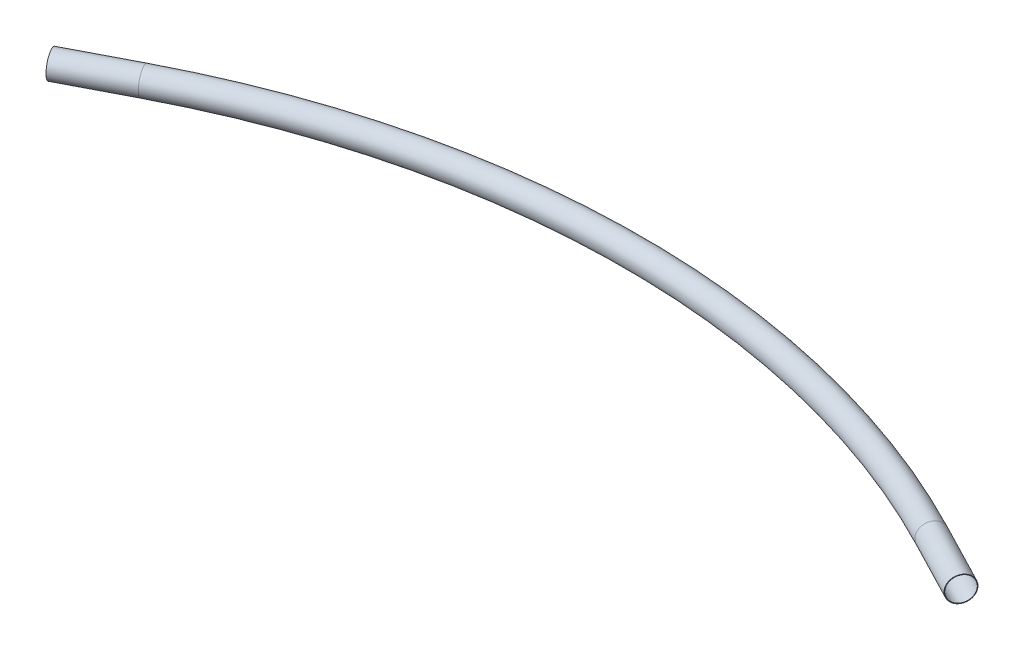
ISO-10303-21;
HEADER;
FILE_DESCRIPTION(('STEP AP214'),'2;1');
FILE_NAME('part.step','',(''),(''),'','','');
FILE_SCHEMA(('AUTOMOTIVE_DESIGN { 1 0 10303 214 1 1 1 1 }'));
ENDSEC;
DATA;
#1=APPLICATION_CONTEXT('core data for automotive mechanical design processes');
#2=APPLICATION_PROTOCOL_DEFINITION('international standard','automotive_design',2000,#1);
#3=PRODUCT_CONTEXT('',#1,'mechanical');
#4=PRODUCT('Part','Part','',(#3));
#5=PRODUCT_RELATED_PRODUCT_CATEGORY('part','',(#4));
#6=PRODUCT_DEFINITION_FORMATION('','',#4);
#7=PRODUCT_DEFINITION_CONTEXT('part definition',#1,'design');
#8=PRODUCT_DEFINITION('design','',#6,#7);
#9=PRODUCT_DEFINITION_SHAPE('','',#8);
#10=(LENGTH_UNIT() NAMED_UNIT(*) SI_UNIT(.MILLI.,.METRE.));
#11=(NAMED_UNIT(*) PLANE_ANGLE_UNIT() SI_UNIT($,.RADIAN.));
#12=(NAMED_UNIT(*) SI_UNIT($,.STERADIAN.) SOLID_ANGLE_UNIT());
#13=UNCERTAINTY_MEASURE_WITH_UNIT(LENGTH_MEASURE(1.E-05),#10,'distance_accuracy_value','');
#14=(GEOMETRIC_REPRESENTATION_CONTEXT(3) GLOBAL_UNCERTAINTY_ASSIGNED_CONTEXT((#13)) GLOBAL_UNIT_ASSIGNED_CONTEXT((#10,
#11,#12)) REPRESENTATION_CONTEXT('',''));
#15=CARTESIAN_POINT('',(0.,0.,0.));
#16=DIRECTION('',(0.,0.,1.));
#17=DIRECTION('',(1.,0.,0.));
#18=AXIS2_PLACEMENT_3D('',#15,#16,#17);
#19=CARTESIAN_POINT('',(-3036.38064650216,0.,210.434297638426));
#20=DIRECTION('',(0.887780285437791,0.,-0.460267492647475));
#21=DIRECTION('',(-0.460267492647475,0.,-0.887780285437792));
#22=AXIS2_PLACEMENT_3D('',#19,#20,#21);
#23=CYLINDRICAL_SURFACE('',#22,80.7339);
#24=CARTESIAN_POINT('',(-3036.38064650216,0.,210.434297638426));
#25=DIRECTION('',(-0.887780285437791,0.,0.460267492647476));
#26=DIRECTION('',(0.460267492647476,0.,0.887780285437791));
#27=AXIS2_PLACEMENT_3D('',#24,#25,#26);
#28=CIRCLE('',#27,80.7339);
#29=CARTESIAN_POINT('',(-2999.22145677751,0.,282.108262424932));
#30=VERTEX_POINT('',#29);
#31=EDGE_CURVE('E52',#30,#30,#28,.T.);
#32=ORIENTED_EDGE('',*,*,#31,.T.);
#33=EDGE_LOOP('',(#32));
#34=FACE_BOUND('',#33,.T.);
#35=CARTESIAN_POINT('',(-2630.4875,0.,0.));
#36=DIRECTION('',(-0.887780285437791,0.,0.460267492647476));
#37=DIRECTION('',(0.460267492647476,0.,0.887780285437791));
#38=AXIS2_PLACEMENT_3D('',#35,#36,#37);
#39=CIRCLE('',#38,80.7339);
#40=CARTESIAN_POINT('',(-2593.32831027535,0.,71.6739647865061));
#41=VERTEX_POINT('',#40);
#42=EDGE_CURVE('E58',#41,#41,#39,.T.);
#43=ORIENTED_EDGE('',*,*,#42,.F.);
#44=EDGE_LOOP('',(#43));
#45=FACE_BOUND('',#44,.T.);
#46=ADVANCED_FACE('F45',(#34,#45),#23,.F.);
#47=CARTESIAN_POINT('',(-3036.38064650216,0.,210.434297638426));
#48=DIRECTION('',(0.887780285437791,0.,-0.460267492647475));
#49=DIRECTION('',(-0.460267492647475,0.,-0.887780285437792));
#50=AXIS2_PLACEMENT_3D('',#47,#48,#49);
#51=CYLINDRICAL_SURFACE('',#50,84.1375000000001);
#52=CARTESIAN_POINT('',(-3036.38064650216,0.,210.434297638426));
#53=DIRECTION('',(-0.887780285437791,0.,0.460267492647476));
#54=DIRECTION('',(0.460267492647476,0.,0.887780285437791));
#55=AXIS2_PLACEMENT_3D('',#52,#53,#54);
#56=CIRCLE('',#55,84.1375000000001);
#57=CARTESIAN_POINT('',(-2997.65489033953,0.,285.129911404448));
#58=VERTEX_POINT('',#57);
#59=EDGE_CURVE('E12',#58,#58,#56,.T.);
#60=ORIENTED_EDGE('',*,*,#59,.F.);
#61=EDGE_LOOP('',(#60));
#62=FACE_BOUND('',#61,.T.);
#63=CARTESIAN_POINT('',(-2630.4875,0.,0.));
#64=DIRECTION('',(-0.887780285437791,0.,0.460267492647476));
#65=DIRECTION('',(0.460267492647476,0.,0.887780285437791));
#66=AXIS2_PLACEMENT_3D('',#63,#64,#65);
#67=CIRCLE('',#66,84.1375000000001);
#68=CARTESIAN_POINT('',(-2591.76174383737,0.,74.6956137660222));
#69=VERTEX_POINT('',#68);
#70=EDGE_CURVE('E48',#69,#69,#67,.T.);
#71=ORIENTED_EDGE('',*,*,#70,.T.);
#72=EDGE_LOOP('',(#71));
#73=FACE_BOUND('',#72,.T.);
#74=ADVANCED_FACE('F65',(#62,#73),#51,.T.);
#75=CARTESIAN_POINT('',(-3036.38064650216,0.,210.434297638426));
#76=DIRECTION('',(-0.887780285437791,0.,0.460267492647476));
#77=DIRECTION('',(0.460267492647476,0.,0.887780285437791));
#78=AXIS2_PLACEMENT_3D('',#75,#76,#77);
#79=PLANE('',#78);
#80=ORIENTED_EDGE('',*,*,#31,.F.);
#81=EDGE_LOOP('',(#80));
#82=FACE_BOUND('',#81,.T.);
#83=ORIENTED_EDGE('',*,*,#59,.T.);
#84=EDGE_LOOP('',(#83));
#85=FACE_BOUND('',#84,.T.);
#86=ADVANCED_FACE('F69',(#82,#85),#79,.T.);
#87=CARTESIAN_POINT('',(-2630.4875,0.,0.));
#88=DIRECTION('',(-0.887780285437791,0.,0.460267492647476));
#89=DIRECTION('',(0.460267492647476,0.,0.887780285437791));
#90=AXIS2_PLACEMENT_3D('',#87,#88,#89);
#91=PLANE('',#90);
#92=ORIENTED_EDGE('',*,*,#42,.T.);
#93=EDGE_LOOP('',(#92));
#94=FACE_BOUND('',#93,.T.);
#95=ORIENTED_EDGE('',*,*,#70,.F.);
#96=EDGE_LOOP('',(#95));
#97=FACE_BOUND('',#96,.T.);
#98=ADVANCED_FACE('F67',(#94,#97),#91,.F.);
#99=CLOSED_SHELL('',(#46,#74,#86,#98));
#100=MANIFOLD_SOLID_BREP('B2',#99);
#101=CARTESIAN_POINT('',(0.,0.,5073.77770730198));
#102=DIRECTION('',(0.,-1.,0.));
#103=DIRECTION('',(0.,0.,-1.));
#104=AXIS2_PLACEMENT_3D('',#101,#102,#103);
#105=TOROIDAL_SURFACE('',#104,5715.12770730198,80.7339);
#106=CARTESIAN_POINT('',(-2630.4875,0.,0.));
#107=DIRECTION('',(-0.887780285437791,0.,0.460267492647476));
#108=DIRECTION('',(0.460267492647476,0.,0.887780285437791));
#109=AXIS2_PLACEMENT_3D('',#106,#107,#108);
#110=CIRCLE('',#109,80.7339);
#111=CARTESIAN_POINT('',(-2667.64668972465,0.,-71.6739647865063));
#112=VERTEX_POINT('',#111);
#113=EDGE_CURVE('E129',#112,#112,#110,.T.);
#114=CARTESIAN_POINT('',(2630.4875,0.,-2.22044604925031E-13));
#115=DIRECTION('',(-0.887780285437791,0.,-0.460267492647476));
#116=DIRECTION('',(-0.460267492647476,0.,0.887780285437791));
#117=AXIS2_PLACEMENT_3D('',#114,#115,#116);
#118=CIRCLE('',#117,80.7339);
#119=CARTESIAN_POINT('',(2667.64668972465,0.,-71.6739647865063));
#120=VERTEX_POINT('',#119);
#121=EDGE_CURVE('E137',#120,#120,#118,.T.);
#122=CARTESIAN_POINT('',(0.,0.,5073.77770730198));
#123=DIRECTION('',(0.,-1.,0.));
#124=DIRECTION('',(0.,0.,-1.));
#125=AXIS2_PLACEMENT_3D('',#122,#123,#124);
#126=CIRCLE('',#125,5795.86160730198);
#127=EDGE_CURVE('',#112,#120,#126,.T.);
#128=ORIENTED_EDGE('',*,*,#113,.T.);
#129=ORIENTED_EDGE('',*,*,#121,.F.);
#130=ORIENTED_EDGE('',*,*,#127,.T.);
#131=ORIENTED_EDGE('',*,*,#127,.F.);
#132=EDGE_LOOP('',(#128,#130,#129,#131));
#133=FACE_BOUND('',#132,.T.);
#134=ADVANCED_FACE('F122',(#133),#105,.F.);
#135=CARTESIAN_POINT('',(0.,0.,5073.77770730198));
#136=DIRECTION('',(0.,-1.,0.));
#137=DIRECTION('',(0.,0.,-1.));
#138=AXIS2_PLACEMENT_3D('',#135,#136,#137);
#139=TOROIDAL_SURFACE('',#138,5715.12770730198,84.1375000000001);
#140=CARTESIAN_POINT('',(-2630.4875,0.,0.));
#141=DIRECTION('',(-0.887780285437791,0.,0.460267492647476));
#142=DIRECTION('',(0.460267492647476,0.,0.887780285437791));
#143=AXIS2_PLACEMENT_3D('',#140,#141,#142);
#144=CIRCLE('',#143,84.1375000000001);
#145=CARTESIAN_POINT('',(-2669.21325616263,0.,-74.6956137660222));
#146=VERTEX_POINT('',#145);
#147=EDGE_CURVE('E44',#146,#146,#144,.T.);
#148=CARTESIAN_POINT('',(2630.4875,0.,-2.22044604925031E-13));
#149=DIRECTION('',(-0.887780285437791,0.,-0.460267492647476));
#150=DIRECTION('',(-0.460267492647476,0.,0.887780285437791));
#151=AXIS2_PLACEMENT_3D('',#148,#149,#150);
#152=CIRCLE('',#151,84.1375000000001);
#153=CARTESIAN_POINT('',(2669.21325616263,0.,-74.6956137660222));
#154=VERTEX_POINT('',#153);
#155=EDGE_CURVE('E133',#154,#154,#152,.T.);
#156=CARTESIAN_POINT('',(0.,0.,5073.77770730198));
#157=DIRECTION('',(0.,-1.,0.));
#158=DIRECTION('',(0.,0.,-1.));
#159=AXIS2_PLACEMENT_3D('',#156,#157,#158);
#160=CIRCLE('',#159,5799.26520730198);
#161=EDGE_CURVE('',#146,#154,#160,.T.);
#162=ORIENTED_EDGE('',*,*,#147,.F.);
#163=ORIENTED_EDGE('',*,*,#155,.T.);
#164=ORIENTED_EDGE('',*,*,#161,.T.);
#165=ORIENTED_EDGE('',*,*,#161,.F.);
#166=EDGE_LOOP('',(#162,#164,#163,#165));
#167=FACE_BOUND('',#166,.T.);
#168=ADVANCED_FACE('F124',(#167),#139,.T.);
#169=CARTESIAN_POINT('',(-2630.4875,0.,0.));
#170=DIRECTION('',(-0.887780285437791,0.,0.460267492647476));
#171=DIRECTION('',(0.460267492647476,0.,0.887780285437791));
#172=AXIS2_PLACEMENT_3D('',#169,#170,#171);
#173=PLANE('',#172);
#174=ORIENTED_EDGE('',*,*,#113,.F.);
#175=EDGE_LOOP('',(#174));
#176=FACE_BOUND('',#175,.T.);
#177=ORIENTED_EDGE('',*,*,#147,.T.);
#178=EDGE_LOOP('',(#177));
#179=FACE_BOUND('',#178,.T.);
#180=ADVANCED_FACE('F147',(#176,#179),#173,.T.);
#181=CARTESIAN_POINT('',(2630.4875,0.,-2.22044604925031E-13));
#182=DIRECTION('',(-0.887780285437791,0.,-0.460267492647476));
#183=DIRECTION('',(-0.460267492647476,0.,0.887780285437791));
#184=AXIS2_PLACEMENT_3D('',#181,#182,#183);
#185=PLANE('',#184);
#186=ORIENTED_EDGE('',*,*,#121,.T.);
#187=EDGE_LOOP('',(#186));
#188=FACE_BOUND('',#187,.T.);
#189=ORIENTED_EDGE('',*,*,#155,.F.);
#190=EDGE_LOOP('',(#189));
#191=FACE_BOUND('',#190,.T.);
#192=ADVANCED_FACE('F143',(#188,#191),#185,.F.);
#193=CLOSED_SHELL('',(#134,#168,#180,#192));
#194=MANIFOLD_SOLID_BREP('B7',#193);
#195=CARTESIAN_POINT('',(2630.4875,0.,-2.22044604925031E-13));
#196=DIRECTION('',(0.887780285437791,0.,0.460267492647475));
#197=DIRECTION('',(0.460267492647475,0.,-0.887780285437792));
#198=AXIS2_PLACEMENT_3D('',#195,#196,#197);
#199=CYLINDRICAL_SURFACE('',#198,80.7339);
#200=CARTESIAN_POINT('',(2630.4875,0.,-2.22044604925031E-13));
#201=DIRECTION('',(-0.887780285437791,0.,-0.460267492647476));
#202=DIRECTION('',(-0.460267492647476,0.,0.887780285437791));
#203=AXIS2_PLACEMENT_3D('',#200,#201,#202);
#204=CIRCLE('',#203,80.7339);
#205=CARTESIAN_POINT('',(2667.64668972465,0.,-71.6739647865062));
#206=VERTEX_POINT('',#205);
#207=EDGE_CURVE('E199',#206,#206,#204,.T.);
#208=CARTESIAN_POINT('',(3036.38064650216,0.,210.434297638425));
#209=DIRECTION('',(-0.887780285437791,0.,-0.460267492647476));
#210=DIRECTION('',(-0.460267492647476,0.,0.887780285437791));
#211=AXIS2_PLACEMENT_3D('',#208,#209,#210);
#212=CIRCLE('',#211,80.7339);
#213=CARTESIAN_POINT('',(3073.53983622681,0.,138.760332851919));
#214=VERTEX_POINT('',#213);
#215=EDGE_CURVE('E205',#214,#214,#212,.T.);
#216=CARTESIAN_POINT('',(2667.64668972465,0.,-71.6739647865062));
#217=CARTESIAN_POINT('',(2671.87474333405,0.,-69.4819408527727));
#218=CARTESIAN_POINT('',(2676.10279694345,0.,-67.2899169190391));
#219=CARTESIAN_POINT('',(2684.55890416224,0.,-62.9058690515718));
#220=CARTESIAN_POINT('',(2688.78695777164,0.,-60.7138451178382));
#221=CARTESIAN_POINT('',(2697.24306499043,0.,-56.329797250371));
#222=CARTESIAN_POINT('',(2701.47111859983,0.,-54.1377733166374));
#223=CARTESIAN_POINT('',(2709.92722581863,0.,-49.7537254491702));
#224=CARTESIAN_POINT('',(2714.15527942802,0.,-47.5617015154366));
#225=CARTESIAN_POINT('',(2722.61138664682,0.,-43.1776536479694));
#226=CARTESIAN_POINT('',(2726.83944025622,0.,-40.9856297142358));
#227=CARTESIAN_POINT('',(2735.29554747501,0.,-36.6015818467686));
#228=CARTESIAN_POINT('',(2739.52360108441,0.,-34.409557913035));
#229=CARTESIAN_POINT('',(2747.9797083032,0.,-30.0255100455678));
#230=CARTESIAN_POINT('',(2752.2077619126,0.,-27.8334861118342));
#231=CARTESIAN_POINT('',(2760.6638691314,0.,-23.449438244367));
#232=CARTESIAN_POINT('',(2764.89192274079,0.,-21.2574143106334));
#233=CARTESIAN_POINT('',(2773.34802995959,0.,-16.8733664431662));
#234=CARTESIAN_POINT('',(2777.57608356899,0.,-14.6813425094326));
#235=CARTESIAN_POINT('',(2786.03219078778,0.,-10.2972946419654));
#236=CARTESIAN_POINT('',(2790.26024439718,0.,-8.10527070823175));
#237=CARTESIAN_POINT('',(2798.71635161597,0.,-3.72122284076455));
#238=CARTESIAN_POINT('',(2802.94440522537,0.,-1.52919890703101));
#239=CARTESIAN_POINT('',(2811.40051244417,0.,2.85484896043618));
#240=CARTESIAN_POINT('',(2815.62856605356,0.,5.04687289416984));
#241=CARTESIAN_POINT('',(2824.08467327236,0.,9.43092076163704));
#242=CARTESIAN_POINT('',(2828.31272688176,0.,11.6229446953706));
#243=CARTESIAN_POINT('',(2836.76883410055,0.,16.0069925628378));
#244=CARTESIAN_POINT('',(2840.99688770995,0.,18.1990164965714));
#245=CARTESIAN_POINT('',(2849.45299492874,0.,22.5830643640386));
#246=CARTESIAN_POINT('',(2853.68104853814,0.,24.7750882977723));
#247=CARTESIAN_POINT('',(2862.13715575694,0.,29.1591361652394));
#248=CARTESIAN_POINT('',(2866.36520936633,0.,31.351160098973));
#249=CARTESIAN_POINT('',(2874.82131658513,0.,35.7352079664402));
#250=CARTESIAN_POINT('',(2879.04937019453,0.,37.9272319001739));
#251=CARTESIAN_POINT('',(2887.50547741332,0.,42.3112797676411));
#252=CARTESIAN_POINT('',(2891.73353102272,0.,44.5033037013746));
#253=CARTESIAN_POINT('',(2900.18963824151,0.,48.8873515688418));
#254=CARTESIAN_POINT('',(2904.41769185091,0.,51.0793755025755));
#255=CARTESIAN_POINT('',(2912.87379906971,0.,55.4634233700427));
#256=CARTESIAN_POINT('',(2917.1018526791,0.,57.6554473037762));
#257=CARTESIAN_POINT('',(2925.5579598979,0.,62.0394951712434));
#258=CARTESIAN_POINT('',(2929.7860135073,0.,64.2315191049771));
#259=CARTESIAN_POINT('',(2938.24212072609,0.,68.6155669724443));
#260=CARTESIAN_POINT('',(2942.47017433549,0.,70.8075909061778));
#261=CARTESIAN_POINT('',(2950.92628155428,0.,75.191638773645));
#262=CARTESIAN_POINT('',(2955.15433516368,0.,77.3836627073786));
#263=CARTESIAN_POINT('',(2963.61044238248,0.,81.7677105748459));
#264=CARTESIAN_POINT('',(2967.83849599187,0.,83.9597345085794));
#265=CARTESIAN_POINT('',(2976.29460321067,0.,88.3437823760466));
#266=CARTESIAN_POINT('',(2980.52265682007,0.,90.5358063097803));
#267=CARTESIAN_POINT('',(2988.97876403886,0.,94.9198541772475));
#268=CARTESIAN_POINT('',(2993.20681764826,0.,97.111878110981));
#269=CARTESIAN_POINT('',(3001.66292486705,0.,101.495925978448));
#270=CARTESIAN_POINT('',(3005.89097847645,0.,103.687949912182));
#271=CARTESIAN_POINT('',(3014.34708569525,0.,108.071997779649));
#272=CARTESIAN_POINT('',(3018.57513930464,0.,110.264021713383));
#273=CARTESIAN_POINT('',(3027.03124652344,0.,114.64806958085));
#274=CARTESIAN_POINT('',(3031.25930013284,0.,116.840093514583));
#275=CARTESIAN_POINT('',(3039.71540735163,0.,121.224141382051));
#276=CARTESIAN_POINT('',(3043.94346096103,0.,123.416165315784));
#277=CARTESIAN_POINT('',(3052.39956817982,0.,127.800213183251));
#278=CARTESIAN_POINT('',(3056.62762178922,0.,129.992237116985));
#279=CARTESIAN_POINT('',(3065.08372900802,0.,134.376284984452));
#280=CARTESIAN_POINT('',(3069.31178261741,0.,136.568308918186));
#281=CARTESIAN_POINT('',(3073.53983622681,0.,138.760332851919));
#282=B_SPLINE_CURVE_WITH_KNOTS('',3,(#216,#217,#218,#219,#220,#221,#222,#223,#224,#225,#226,
#227,#228,#229,#230,#231,#232,#233,#234,#235,#236,#237,#238,#239,#240,#241,#242,#243,#244,#245,
#246,#247,#248,#249,#250,#251,#252,#253,#254,#255,#256,#257,#258,#259,#260,#261,#262,#263,#264,
#265,#266,#267,#268,#269,#270,#271,#272,#273,#274,#275,#276,#277,#278,#279,#280,#281),
.UNSPECIFIED.,.F.,.F.,(4,2,2,2,2,2,2,2,2,2,2,2,2,2,2,2,2,2,2,2,2,2,2,2,2,2,2,2,2,2,2,2,4),(0.,
14.2875000000002,28.575,42.8625000000002,57.15,71.4375000000003,85.7250000000001,100.0125,114.3,
128.5875,142.875,157.1625,171.45,185.7375,200.025,214.3125,228.6,242.8875,257.175,271.4625,
285.75,300.0375,314.325,328.6125,342.9,357.1875,371.475,385.7625,400.05,414.3375,428.625,
442.9125,457.2),.UNSPECIFIED.);
#283=EDGE_CURVE('BSEAM192',#206,#214,#282,.T.);
#284=ORIENTED_EDGE('',*,*,#207,.T.);
#285=ORIENTED_EDGE('',*,*,#215,.F.);
#286=ORIENTED_EDGE('',*,*,#283,.T.);
#287=ORIENTED_EDGE('',*,*,#283,.F.);
#288=EDGE_LOOP('',(#284,#286,#285,#287));
#289=FACE_BOUND('',#288,.T.);
#290=ADVANCED_FACE('F192',(#289),#199,.F.);
#291=CARTESIAN_POINT('',(2630.4875,0.,-2.22044604925031E-13));
#292=DIRECTION('',(0.887780285437791,0.,0.460267492647475));
#293=DIRECTION('',(0.460267492647475,0.,-0.887780285437792));
#294=AXIS2_PLACEMENT_3D('',#291,#292,#293);
#295=CYLINDRICAL_SURFACE('',#294,84.1375000000001);
#296=CARTESIAN_POINT('',(2630.4875,0.,-2.22044604925031E-13));
#297=DIRECTION('',(-0.887780285437791,0.,-0.460267492647476));
#298=DIRECTION('',(-0.460267492647476,0.,0.887780285437791));
#299=AXIS2_PLACEMENT_3D('',#296,#297,#298);
#300=CIRCLE('',#299,84.1375000000001);
#301=CARTESIAN_POINT('',(2669.21325616263,0.,-74.6956137660225));
#302=VERTEX_POINT('',#301);
#303=EDGE_CURVE('E121',#302,#302,#300,.T.);
#304=CARTESIAN_POINT('',(3036.38064650216,0.,210.434297638425));
#305=DIRECTION('',(-0.887780285437791,0.,-0.460267492647476));
#306=DIRECTION('',(-0.460267492647476,0.,0.887780285437791));
#307=AXIS2_PLACEMENT_3D('',#304,#305,#306);
#308=CIRCLE('',#307,84.1375000000001);
#309=CARTESIAN_POINT('',(3075.10640266479,0.,135.738683872403));
#310=VERTEX_POINT('',#309);
#311=EDGE_CURVE('E195',#310,#310,#308,.T.);
#312=CARTESIAN_POINT('',(2669.21325616263,0.,-74.6956137660225));
#313=CARTESIAN_POINT('',(2673.44130977202,0.,-72.5035898322888));
#314=CARTESIAN_POINT('',(2677.66936338142,0.,-70.3115658985553));
#315=CARTESIAN_POINT('',(2686.12547060022,0.,-65.9275180310881));
#316=CARTESIAN_POINT('',(2690.35352420961,0.,-63.7354940973546));
#317=CARTESIAN_POINT('',(2698.80963142841,0.,-59.3514462298873));
#318=CARTESIAN_POINT('',(2703.03768503781,0.,-57.1594222961537));
#319=CARTESIAN_POINT('',(2711.4937922566,0.,-52.7753744286865));
#320=CARTESIAN_POINT('',(2715.721845866,0.,-50.583350494953));
#321=CARTESIAN_POINT('',(2724.17795308479,0.,-46.1993026274857));
#322=CARTESIAN_POINT('',(2728.40600669419,0.,-44.0072786937521));
#323=CARTESIAN_POINT('',(2736.86211391299,0.,-39.6232308262849));
#324=CARTESIAN_POINT('',(2741.09016752238,0.,-37.4312068925513));
#325=CARTESIAN_POINT('',(2749.54627474118,0.,-33.0471590250841));
#326=CARTESIAN_POINT('',(2753.77432835058,0.,-30.8551350913505));
#327=CARTESIAN_POINT('',(2762.23043556937,0.,-26.4710872238833));
#328=CARTESIAN_POINT('',(2766.45848917877,0.,-24.2790632901497));
#329=CARTESIAN_POINT('',(2774.91459639756,0.,-19.8950154226825));
#330=CARTESIAN_POINT('',(2779.14265000696,0.,-17.7029914889489));
#331=CARTESIAN_POINT('',(2787.59875722576,0.,-13.3189436214817));
#332=CARTESIAN_POINT('',(2791.82681083515,0.,-11.1269196877481));
#333=CARTESIAN_POINT('',(2800.28291805395,0.,-6.74287182028093));
#334=CARTESIAN_POINT('',(2804.51097166335,0.,-4.55084788654727));
#335=CARTESIAN_POINT('',(2812.96707888214,0.,-0.166800019080064));
#336=CARTESIAN_POINT('',(2817.19513249154,0.,2.02522391465349));
#337=CARTESIAN_POINT('',(2825.65123971033,0.,6.40927178212066));
#338=CARTESIAN_POINT('',(2829.87929331973,0.,8.60129571585429));
#339=CARTESIAN_POINT('',(2838.33540053853,0.,12.9853435833215));
#340=CARTESIAN_POINT('',(2842.56345414792,0.,15.1773675170551));
#341=CARTESIAN_POINT('',(2851.01956136672,0.,19.5614153845223));
#342=CARTESIAN_POINT('',(2855.24761497612,0.,21.7534393182559));
#343=CARTESIAN_POINT('',(2863.70372219491,0.,26.1374871857231));
#344=CARTESIAN_POINT('',(2867.93177580431,0.,28.3295111194567));
#345=CARTESIAN_POINT('',(2876.3878830231,0.,32.7135589869239));
#346=CARTESIAN_POINT('',(2880.6159366325,0.,34.9055829206575));
#347=CARTESIAN_POINT('',(2889.0720438513,0.,39.2896307881247));
#348=CARTESIAN_POINT('',(2893.30009746069,0.,41.4816547218583));
#349=CARTESIAN_POINT('',(2901.75620467949,0.,45.8657025893255));
#350=CARTESIAN_POINT('',(2905.98425828889,0.,48.0577265230591));
#351=CARTESIAN_POINT('',(2914.44036550768,0.,52.4417743905263));
#352=CARTESIAN_POINT('',(2918.66841911708,0.,54.63379832426));
#353=CARTESIAN_POINT('',(2927.12452633587,0.,59.0178461917272));
#354=CARTESIAN_POINT('',(2931.35257994527,0.,61.2098701254607));
#355=CARTESIAN_POINT('',(2939.80868716407,0.,65.5939179929279));
#356=CARTESIAN_POINT('',(2944.03674077346,0.,67.7859419266616));
#357=CARTESIAN_POINT('',(2952.49284799226,0.,72.1699897941288));
#358=CARTESIAN_POINT('',(2956.72090160166,0.,74.3620137278623));
#359=CARTESIAN_POINT('',(2965.17700882045,0.,78.7460615953295));
#360=CARTESIAN_POINT('',(2969.40506242985,0.,80.9380855290632));
#361=CARTESIAN_POINT('',(2977.86116964864,0.,85.3221333965304));
#362=CARTESIAN_POINT('',(2982.08922325804,0.,87.5141573302639));
#363=CARTESIAN_POINT('',(2990.54533047684,0.,91.8982051977311));
#364=CARTESIAN_POINT('',(2994.77338408623,0.,94.0902291314648));
#365=CARTESIAN_POINT('',(3003.22949130503,0.,98.474276998932));
#366=CARTESIAN_POINT('',(3007.45754491443,0.,100.666300932666));
#367=CARTESIAN_POINT('',(3015.91365213322,0.,105.050348800133));
#368=CARTESIAN_POINT('',(3020.14170574262,0.,107.242372733866));
#369=CARTESIAN_POINT('',(3028.59781296141,0.,111.626420601334));
#370=CARTESIAN_POINT('',(3032.82586657081,0.,113.818444535067));
#371=CARTESIAN_POINT('',(3041.28197378961,0.,118.202492402534));
#372=CARTESIAN_POINT('',(3045.510027399,0.,120.394516336268));
#373=CARTESIAN_POINT('',(3053.9661346178,0.,124.778564203735));
#374=CARTESIAN_POINT('',(3058.1941882272,0.,126.970588137469));
#375=CARTESIAN_POINT('',(3066.65029544599,0.,131.354636004936));
#376=CARTESIAN_POINT('',(3070.87834905539,0.,133.54665993867));
#377=CARTESIAN_POINT('',(3075.10640266479,0.,135.738683872403));
#378=B_SPLINE_CURVE_WITH_KNOTS('',3,(#312,#313,#314,#315,#316,#317,#318,#319,#320,#321,#322,
#323,#324,#325,#326,#327,#328,#329,#330,#331,#332,#333,#334,#335,#336,#337,#338,#339,#340,#341,
#342,#343,#344,#345,#346,#347,#348,#349,#350,#351,#352,#353,#354,#355,#356,#357,#358,#359,#360,
#361,#362,#363,#364,#365,#366,#367,#368,#369,#370,#371,#372,#373,#374,#375,#376,#377),
.UNSPECIFIED.,.F.,.F.,(4,2,2,2,2,2,2,2,2,2,2,2,2,2,2,2,2,2,2,2,2,2,2,2,2,2,2,2,2,2,2,2,4),(0.,
14.2874999999998,28.575,42.8624999999998,57.1500000000001,71.4374999999999,85.7250000000001,
100.0125,114.3,128.5875,142.875,157.1625,171.45,185.7375,200.025,214.3125,228.6,242.8875,
257.175,271.4625,285.75,300.0375,314.325,328.6125,342.9,357.1875,371.475,385.7625,400.05,
414.3375,428.625,442.9125,457.2),.UNSPECIFIED.);
#379=EDGE_CURVE('BSEAM212',#302,#310,#378,.T.);
#380=ORIENTED_EDGE('',*,*,#303,.F.);
#381=ORIENTED_EDGE('',*,*,#311,.T.);
#382=ORIENTED_EDGE('',*,*,#379,.T.);
#383=ORIENTED_EDGE('',*,*,#379,.F.);
#384=EDGE_LOOP('',(#380,#382,#381,#383));
#385=FACE_BOUND('',#384,.T.);
#386=ADVANCED_FACE('F212',(#385),#295,.T.);
#387=CARTESIAN_POINT('',(2630.4875,0.,-2.22044604925031E-13));
#388=DIRECTION('',(-0.887780285437791,0.,-0.460267492647476));
#389=DIRECTION('',(-0.460267492647476,0.,0.887780285437791));
#390=AXIS2_PLACEMENT_3D('',#387,#388,#389);
#391=PLANE('',#390);
#392=ORIENTED_EDGE('',*,*,#207,.F.);
#393=EDGE_LOOP('',(#392));
#394=FACE_BOUND('',#393,.T.);
#395=ORIENTED_EDGE('',*,*,#303,.T.);
#396=EDGE_LOOP('',(#395));
#397=FACE_BOUND('',#396,.T.);
#398=ADVANCED_FACE('F216',(#394,#397),#391,.T.);
#399=CARTESIAN_POINT('',(3036.38064650216,0.,210.434297638425));
#400=DIRECTION('',(-0.887780285437791,0.,-0.460267492647476));
#401=DIRECTION('',(-0.460267492647476,0.,0.887780285437791));
#402=AXIS2_PLACEMENT_3D('',#399,#400,#401);
#403=PLANE('',#402);
#404=ORIENTED_EDGE('',*,*,#215,.T.);
#405=EDGE_LOOP('',(#404));
#406=FACE_BOUND('',#405,.T.);
#407=ORIENTED_EDGE('',*,*,#311,.F.);
#408=EDGE_LOOP('',(#407));
#409=FACE_BOUND('',#408,.T.);
#410=ADVANCED_FACE('F214',(#406,#409),#403,.F.);
#411=CLOSED_SHELL('',(#290,#386,#398,#410));
#412=MANIFOLD_SOLID_BREP('B39',#411);
#413=ADVANCED_BREP_SHAPE_REPRESENTATION('',(#18,#100,#194,#412),#14);
#414=SHAPE_DEFINITION_REPRESENTATION(#9,#413);
ENDSEC;
END-ISO-10303-21;
